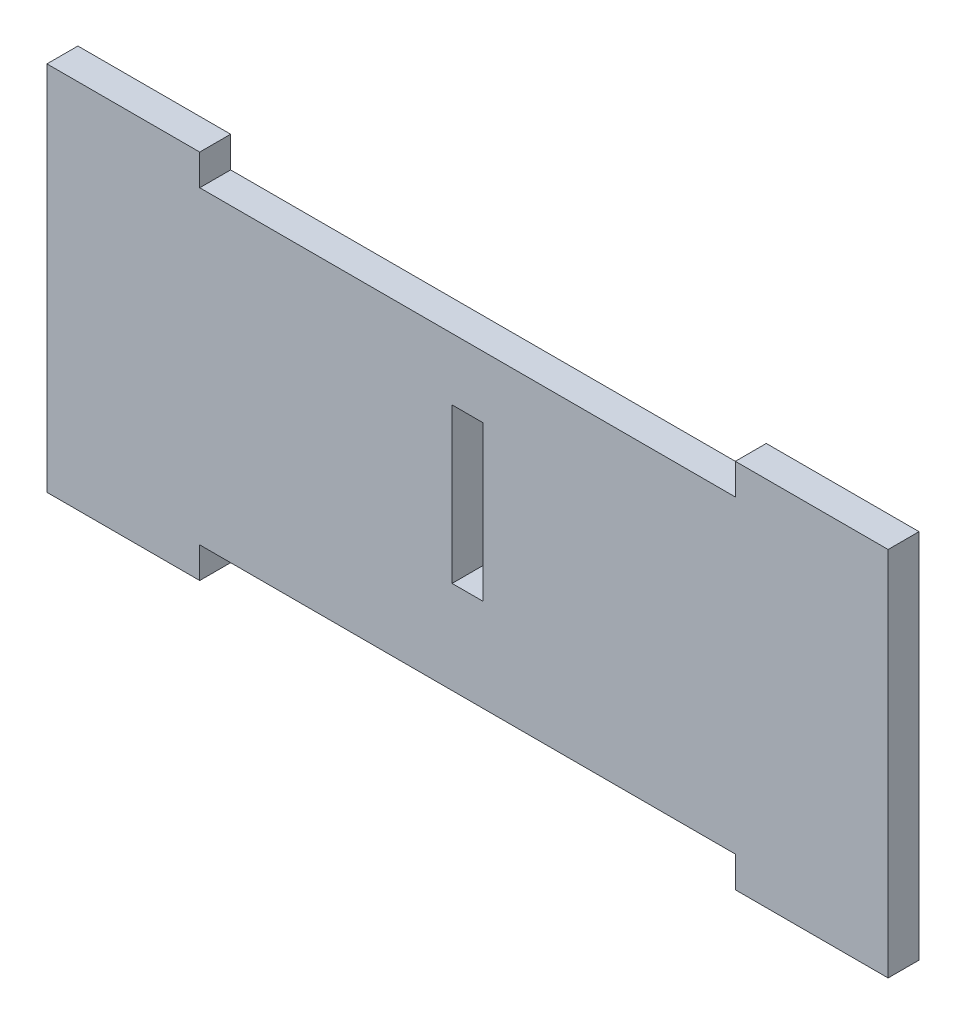
ISO-10303-21;
HEADER;
FILE_DESCRIPTION(('STEP AP214'),'2;1');
FILE_NAME('part.step','',(''),(''),'','','');
FILE_SCHEMA(('AUTOMOTIVE_DESIGN { 1 0 10303 214 1 1 1 1 }'));
ENDSEC;
DATA;
#1=APPLICATION_CONTEXT('core data for automotive mechanical design processes');
#2=APPLICATION_PROTOCOL_DEFINITION('international standard','automotive_design',2000,#1);
#3=PRODUCT_CONTEXT('',#1,'mechanical');
#4=PRODUCT('Part','Part','',(#3));
#5=PRODUCT_RELATED_PRODUCT_CATEGORY('part','',(#4));
#6=PRODUCT_DEFINITION_FORMATION('','',#4);
#7=PRODUCT_DEFINITION_CONTEXT('part definition',#1,'design');
#8=PRODUCT_DEFINITION('design','',#6,#7);
#9=PRODUCT_DEFINITION_SHAPE('','',#8);
#10=(LENGTH_UNIT() NAMED_UNIT(*) SI_UNIT(.MILLI.,.METRE.));
#11=(NAMED_UNIT(*) PLANE_ANGLE_UNIT() SI_UNIT($,.RADIAN.));
#12=(NAMED_UNIT(*) SI_UNIT($,.STERADIAN.) SOLID_ANGLE_UNIT());
#13=UNCERTAINTY_MEASURE_WITH_UNIT(LENGTH_MEASURE(1.E-05),#10,'distance_accuracy_value','');
#14=(GEOMETRIC_REPRESENTATION_CONTEXT(3) GLOBAL_UNCERTAINTY_ASSIGNED_CONTEXT((#13)) GLOBAL_UNIT_ASSIGNED_CONTEXT((#10,
#11,#12)) REPRESENTATION_CONTEXT('',''));
#15=CARTESIAN_POINT('',(0.,0.,0.));
#16=DIRECTION('',(0.,0.,1.));
#17=DIRECTION('',(1.,0.,0.));
#18=AXIS2_PLACEMENT_3D('',#15,#16,#17);
#19=CARTESIAN_POINT('',(-68.,0.,5.));
#20=DIRECTION('',(0.,1.,0.));
#21=DIRECTION('',(0.,0.,1.));
#22=AXIS2_PLACEMENT_3D('',#19,#20,#21);
#23=PLANE('',#22);
#24=DIRECTION('',(0.,0.,-1.));
#25=VECTOR('',#24,1.);
#26=CARTESIAN_POINT('',(43.3,0.,5.));
#27=LINE('',#26,#25);
#28=CARTESIAN_POINT('',(43.3,0.,5.));
#29=VERTEX_POINT('',#28);
#30=CARTESIAN_POINT('',(43.3,0.,0.));
#31=VERTEX_POINT('',#30);
#32=EDGE_CURVE('E191',#29,#31,#27,.T.);
#33=ORIENTED_EDGE('',*,*,#32,.F.);
#34=DIRECTION('',(1.,0.,0.));
#35=VECTOR('',#34,1.);
#36=CARTESIAN_POINT('',(-68.,0.,5.));
#37=LINE('',#36,#35);
#38=CARTESIAN_POINT('',(-43.3,0.,5.));
#39=VERTEX_POINT('',#38);
#40=EDGE_CURVE('E300',#39,#29,#37,.T.);
#41=ORIENTED_EDGE('',*,*,#40,.F.);
#42=DIRECTION('',(0.,0.,1.));
#43=VECTOR('',#42,1.);
#44=CARTESIAN_POINT('',(-43.3,0.,5.));
#45=LINE('',#44,#43);
#46=CARTESIAN_POINT('',(-43.3,0.,0.));
#47=VERTEX_POINT('',#46);
#48=EDGE_CURVE('E218',#47,#39,#45,.T.);
#49=ORIENTED_EDGE('',*,*,#48,.F.);
#50=DIRECTION('',(1.,0.,0.));
#51=VECTOR('',#50,1.);
#52=CARTESIAN_POINT('',(-68.,0.,0.));
#53=LINE('',#52,#51);
#54=EDGE_CURVE('E308',#47,#31,#53,.T.);
#55=ORIENTED_EDGE('',*,*,#54,.T.);
#56=EDGE_LOOP('',(#33,#41,#49,#55));
#57=FACE_BOUND('',#56,.T.);
#58=ADVANCED_FACE('F38',(#57),#23,.F.);
#59=CARTESIAN_POINT('',(-68.,50.,5.));
#60=DIRECTION('',(0.,-1.,0.));
#61=DIRECTION('',(0.,0.,-1.));
#62=AXIS2_PLACEMENT_3D('',#59,#60,#61);
#63=PLANE('',#62);
#64=DIRECTION('',(0.,0.,1.));
#65=VECTOR('',#64,1.);
#66=CARTESIAN_POINT('',(43.3,50.,0.));
#67=LINE('',#66,#65);
#68=CARTESIAN_POINT('',(43.3,50.,0.));
#69=VERTEX_POINT('',#68);
#70=CARTESIAN_POINT('',(43.3,50.,5.));
#71=VERTEX_POINT('',#70);
#72=EDGE_CURVE('E244',#69,#71,#67,.T.);
#73=ORIENTED_EDGE('',*,*,#72,.F.);
#74=DIRECTION('',(-1.,0.,0.));
#75=VECTOR('',#74,1.);
#76=CARTESIAN_POINT('',(-68.,50.,0.));
#77=LINE('',#76,#75);
#78=CARTESIAN_POINT('',(-43.3,50.,0.));
#79=VERTEX_POINT('',#78);
#80=EDGE_CURVE('E42',#69,#79,#77,.T.);
#81=ORIENTED_EDGE('',*,*,#80,.T.);
#82=DIRECTION('',(0.,0.,-1.));
#83=VECTOR('',#82,1.);
#84=CARTESIAN_POINT('',(-43.3,50.,0.));
#85=LINE('',#84,#83);
#86=CARTESIAN_POINT('',(-43.3,50.,5.));
#87=VERTEX_POINT('',#86);
#88=EDGE_CURVE('E270',#87,#79,#85,.T.);
#89=ORIENTED_EDGE('',*,*,#88,.F.);
#90=DIRECTION('',(-1.,0.,0.));
#91=VECTOR('',#90,1.);
#92=CARTESIAN_POINT('',(-68.,50.,5.));
#93=LINE('',#92,#91);
#94=EDGE_CURVE('E11',#71,#87,#93,.T.);
#95=ORIENTED_EDGE('',*,*,#94,.F.);
#96=EDGE_LOOP('',(#73,#81,#89,#95));
#97=FACE_BOUND('',#96,.T.);
#98=ADVANCED_FACE('F320',(#97),#63,.F.);
#99=CARTESIAN_POINT('',(-68.,50.,5.));
#100=DIRECTION('',(1.,0.,0.));
#101=DIRECTION('',(0.,0.,-1.));
#102=AXIS2_PLACEMENT_3D('',#99,#100,#101);
#103=PLANE('',#102);
#104=DIRECTION('',(0.,-1.,0.));
#105=VECTOR('',#104,1.);
#106=CARTESIAN_POINT('',(-68.,50.,0.));
#107=LINE('',#106,#105);
#108=CARTESIAN_POINT('',(-68.,55.,0.));
#109=VERTEX_POINT('',#108);
#110=CARTESIAN_POINT('',(-68.,-5.,0.));
#111=VERTEX_POINT('',#110);
#112=EDGE_CURVE('E296',#109,#111,#107,.T.);
#113=ORIENTED_EDGE('',*,*,#112,.T.);
#114=DIRECTION('',(0.,0.,-1.));
#115=VECTOR('',#114,1.);
#116=CARTESIAN_POINT('',(-68.,-5.,5.));
#117=LINE('',#116,#115);
#118=CARTESIAN_POINT('',(-68.,-5.,5.));
#119=VERTEX_POINT('',#118);
#120=EDGE_CURVE('E219',#119,#111,#117,.T.);
#121=ORIENTED_EDGE('',*,*,#120,.F.);
#122=DIRECTION('',(0.,-1.,0.));
#123=VECTOR('',#122,1.);
#124=CARTESIAN_POINT('',(-68.,50.,5.));
#125=LINE('',#124,#123);
#126=CARTESIAN_POINT('',(-68.,55.,5.));
#127=VERTEX_POINT('',#126);
#128=EDGE_CURVE('E297',#127,#119,#125,.T.);
#129=ORIENTED_EDGE('',*,*,#128,.F.);
#130=DIRECTION('',(0.,0.,1.));
#131=VECTOR('',#130,1.);
#132=CARTESIAN_POINT('',(-68.,55.,0.));
#133=LINE('',#132,#131);
#134=EDGE_CURVE('E271',#109,#127,#133,.T.);
#135=ORIENTED_EDGE('',*,*,#134,.F.);
#136=EDGE_LOOP('',(#113,#121,#129,#135));
#137=FACE_BOUND('',#136,.T.);
#138=ADVANCED_FACE('F40',(#137),#103,.F.);
#139=CARTESIAN_POINT('',(68.,50.,5.));
#140=DIRECTION('',(-1.,0.,0.));
#141=DIRECTION('',(0.,0.,1.));
#142=AXIS2_PLACEMENT_3D('',#139,#140,#141);
#143=PLANE('',#142);
#144=DIRECTION('',(0.,1.,0.));
#145=VECTOR('',#144,1.);
#146=CARTESIAN_POINT('',(68.,50.,0.));
#147=LINE('',#146,#145);
#148=CARTESIAN_POINT('',(68.,-5.,0.));
#149=VERTEX_POINT('',#148);
#150=CARTESIAN_POINT('',(68.,55.,0.));
#151=VERTEX_POINT('',#150);
#152=EDGE_CURVE('E310',#149,#151,#147,.T.);
#153=ORIENTED_EDGE('',*,*,#152,.T.);
#154=DIRECTION('',(0.,0.,-1.));
#155=VECTOR('',#154,1.);
#156=CARTESIAN_POINT('',(68.,55.,0.));
#157=LINE('',#156,#155);
#158=CARTESIAN_POINT('',(68.,55.,5.));
#159=VERTEX_POINT('',#158);
#160=EDGE_CURVE('E245',#159,#151,#157,.T.);
#161=ORIENTED_EDGE('',*,*,#160,.F.);
#162=DIRECTION('',(0.,1.,0.));
#163=VECTOR('',#162,1.);
#164=CARTESIAN_POINT('',(68.,50.,5.));
#165=LINE('',#164,#163);
#166=CARTESIAN_POINT('',(68.,-5.,5.));
#167=VERTEX_POINT('',#166);
#168=EDGE_CURVE('E48',#167,#159,#165,.T.);
#169=ORIENTED_EDGE('',*,*,#168,.F.);
#170=DIRECTION('',(0.,0.,1.));
#171=VECTOR('',#170,1.);
#172=CARTESIAN_POINT('',(68.,-5.,5.));
#173=LINE('',#172,#171);
#174=EDGE_CURVE('E193',#149,#167,#173,.T.);
#175=ORIENTED_EDGE('',*,*,#174,.F.);
#176=EDGE_LOOP('',(#153,#161,#169,#175));
#177=FACE_BOUND('',#176,.T.);
#178=ADVANCED_FACE('F346',(#177),#143,.F.);
#179=CARTESIAN_POINT('',(0.,0.,5.));
#180=DIRECTION('',(0.,0.,1.));
#181=DIRECTION('',(1.,0.,0.));
#182=AXIS2_PLACEMENT_3D('',#179,#180,#181);
#183=PLANE('',#182);
#184=DIRECTION('',(1.,0.,0.));
#185=VECTOR('',#184,1.);
#186=CARTESIAN_POINT('',(2.5,15.,5.));
#187=LINE('',#186,#185);
#188=CARTESIAN_POINT('',(-2.5,15.,5.));
#189=VERTEX_POINT('',#188);
#190=CARTESIAN_POINT('',(2.5,15.,5.));
#191=VERTEX_POINT('',#190);
#192=EDGE_CURVE('E56',#189,#191,#187,.T.);
#193=ORIENTED_EDGE('',*,*,#192,.F.);
#194=DIRECTION('',(0.,-1.,0.));
#195=VECTOR('',#194,1.);
#196=CARTESIAN_POINT('',(-2.5,15.,5.));
#197=LINE('',#196,#195);
#198=CARTESIAN_POINT('',(-2.5,40.,5.));
#199=VERTEX_POINT('',#198);
#200=EDGE_CURVE('E174',#199,#189,#197,.T.);
#201=ORIENTED_EDGE('',*,*,#200,.F.);
#202=DIRECTION('',(-1.,0.,0.));
#203=VECTOR('',#202,1.);
#204=CARTESIAN_POINT('',(-2.5,40.,5.));
#205=LINE('',#204,#203);
#206=CARTESIAN_POINT('',(2.5,40.,5.));
#207=VERTEX_POINT('',#206);
#208=EDGE_CURVE('E156',#207,#199,#205,.T.);
#209=ORIENTED_EDGE('',*,*,#208,.F.);
#210=DIRECTION('',(0.,1.,0.));
#211=VECTOR('',#210,1.);
#212=CARTESIAN_POINT('',(2.5,40.,5.));
#213=LINE('',#212,#211);
#214=EDGE_CURVE('E166',#191,#207,#213,.T.);
#215=ORIENTED_EDGE('',*,*,#214,.F.);
#216=EDGE_LOOP('',(#193,#201,#209,#215));
#217=FACE_BOUND('',#216,.T.);
#218=ORIENTED_EDGE('',*,*,#128,.T.);
#219=DIRECTION('',(-1.,0.,0.));
#220=VECTOR('',#219,1.);
#221=CARTESIAN_POINT('',(-68.,-5.,5.));
#222=LINE('',#221,#220);
#223=CARTESIAN_POINT('',(-43.3,-5.,5.));
#224=VERTEX_POINT('',#223);
#225=EDGE_CURVE('E229',#224,#119,#222,.T.);
#226=ORIENTED_EDGE('',*,*,#225,.F.);
#227=DIRECTION('',(0.,1.,0.));
#228=VECTOR('',#227,1.);
#229=CARTESIAN_POINT('',(-43.3,-5.,5.));
#230=LINE('',#229,#228);
#231=EDGE_CURVE('E233',#224,#39,#230,.T.);
#232=ORIENTED_EDGE('',*,*,#231,.T.);
#233=ORIENTED_EDGE('',*,*,#40,.T.);
#234=DIRECTION('',(0.,1.,0.));
#235=VECTOR('',#234,1.);
#236=CARTESIAN_POINT('',(43.3,-5.,5.));
#237=LINE('',#236,#235);
#238=CARTESIAN_POINT('',(43.3,-5.,5.));
#239=VERTEX_POINT('',#238);
#240=EDGE_CURVE('E214',#239,#29,#237,.T.);
#241=ORIENTED_EDGE('',*,*,#240,.F.);
#242=DIRECTION('',(-1.,0.,0.));
#243=VECTOR('',#242,1.);
#244=CARTESIAN_POINT('',(68.,-5.,5.));
#245=LINE('',#244,#243);
#246=EDGE_CURVE('E197',#167,#239,#245,.T.);
#247=ORIENTED_EDGE('',*,*,#246,.F.);
#248=ORIENTED_EDGE('',*,*,#168,.T.);
#249=DIRECTION('',(1.,0.,0.));
#250=VECTOR('',#249,1.);
#251=CARTESIAN_POINT('',(68.,55.,5.));
#252=LINE('',#251,#250);
#253=CARTESIAN_POINT('',(43.3,55.,5.));
#254=VERTEX_POINT('',#253);
#255=EDGE_CURVE('E255',#254,#159,#252,.T.);
#256=ORIENTED_EDGE('',*,*,#255,.F.);
#257=DIRECTION('',(0.,-1.,0.));
#258=VECTOR('',#257,1.);
#259=CARTESIAN_POINT('',(43.3,55.,5.));
#260=LINE('',#259,#258);
#261=EDGE_CURVE('E259',#254,#71,#260,.T.);
#262=ORIENTED_EDGE('',*,*,#261,.T.);
#263=ORIENTED_EDGE('',*,*,#94,.T.);
#264=DIRECTION('',(0.,-1.,0.));
#265=VECTOR('',#264,1.);
#266=CARTESIAN_POINT('',(-43.3,55.,5.));
#267=LINE('',#266,#265);
#268=CARTESIAN_POINT('',(-43.3,55.,5.));
#269=VERTEX_POINT('',#268);
#270=EDGE_CURVE('E292',#269,#87,#267,.T.);
#271=ORIENTED_EDGE('',*,*,#270,.F.);
#272=DIRECTION('',(1.,0.,0.));
#273=VECTOR('',#272,1.);
#274=CARTESIAN_POINT('',(-68.,55.,5.));
#275=LINE('',#274,#273);
#276=EDGE_CURVE('E275',#127,#269,#275,.T.);
#277=ORIENTED_EDGE('',*,*,#276,.F.);
#278=EDGE_LOOP('',(#218,#226,#232,#233,#241,#247,#248,#256,#262,#263,#271,#277));
#279=FACE_BOUND('',#278,.T.);
#280=ADVANCED_FACE('F171',(#217,#279),#183,.T.);
#281=CARTESIAN_POINT('',(0.,0.,0.));
#282=DIRECTION('',(0.,0.,1.));
#283=DIRECTION('',(1.,0.,0.));
#284=AXIS2_PLACEMENT_3D('',#281,#282,#283);
#285=PLANE('',#284);
#286=DIRECTION('',(0.,1.,0.));
#287=VECTOR('',#286,1.);
#288=CARTESIAN_POINT('',(-2.5,15.,0.));
#289=LINE('',#288,#287);
#290=CARTESIAN_POINT('',(-2.5,15.,0.));
#291=VERTEX_POINT('',#290);
#292=CARTESIAN_POINT('',(-2.5,40.,0.));
#293=VERTEX_POINT('',#292);
#294=EDGE_CURVE('E471',#291,#293,#289,.T.);
#295=ORIENTED_EDGE('',*,*,#294,.F.);
#296=DIRECTION('',(-1.,0.,0.));
#297=VECTOR('',#296,1.);
#298=CARTESIAN_POINT('',(2.5,15.,0.));
#299=LINE('',#298,#297);
#300=CARTESIAN_POINT('',(2.5,15.,0.));
#301=VERTEX_POINT('',#300);
#302=EDGE_CURVE('E192',#301,#291,#299,.T.);
#303=ORIENTED_EDGE('',*,*,#302,.F.);
#304=DIRECTION('',(0.,-1.,0.));
#305=VECTOR('',#304,1.);
#306=CARTESIAN_POINT('',(2.5,40.,0.));
#307=LINE('',#306,#305);
#308=CARTESIAN_POINT('',(2.5,40.,0.));
#309=VERTEX_POINT('',#308);
#310=EDGE_CURVE('E188',#309,#301,#307,.T.);
#311=ORIENTED_EDGE('',*,*,#310,.F.);
#312=DIRECTION('',(1.,0.,0.));
#313=VECTOR('',#312,1.);
#314=CARTESIAN_POINT('',(-2.5,40.,0.));
#315=LINE('',#314,#313);
#316=EDGE_CURVE('E159',#293,#309,#315,.T.);
#317=ORIENTED_EDGE('',*,*,#316,.F.);
#318=EDGE_LOOP('',(#295,#303,#311,#317));
#319=FACE_BOUND('',#318,.T.);
#320=ORIENTED_EDGE('',*,*,#112,.F.);
#321=DIRECTION('',(-1.,0.,0.));
#322=VECTOR('',#321,1.);
#323=CARTESIAN_POINT('',(-68.,55.,0.));
#324=LINE('',#323,#322);
#325=CARTESIAN_POINT('',(-43.3,55.,0.));
#326=VERTEX_POINT('',#325);
#327=EDGE_CURVE('E281',#326,#109,#324,.T.);
#328=ORIENTED_EDGE('',*,*,#327,.F.);
#329=DIRECTION('',(0.,-1.,0.));
#330=VECTOR('',#329,1.);
#331=CARTESIAN_POINT('',(-43.3,55.,0.));
#332=LINE('',#331,#330);
#333=EDGE_CURVE('E285',#326,#79,#332,.T.);
#334=ORIENTED_EDGE('',*,*,#333,.T.);
#335=ORIENTED_EDGE('',*,*,#80,.F.);
#336=DIRECTION('',(0.,-1.,0.));
#337=VECTOR('',#336,1.);
#338=CARTESIAN_POINT('',(43.3,55.,0.));
#339=LINE('',#338,#337);
#340=CARTESIAN_POINT('',(43.3,55.,0.));
#341=VERTEX_POINT('',#340);
#342=EDGE_CURVE('E266',#341,#69,#339,.T.);
#343=ORIENTED_EDGE('',*,*,#342,.F.);
#344=DIRECTION('',(-1.,0.,0.));
#345=VECTOR('',#344,1.);
#346=CARTESIAN_POINT('',(68.,55.,0.));
#347=LINE('',#346,#345);
#348=EDGE_CURVE('E249',#151,#341,#347,.T.);
#349=ORIENTED_EDGE('',*,*,#348,.F.);
#350=ORIENTED_EDGE('',*,*,#152,.F.);
#351=DIRECTION('',(1.,0.,0.));
#352=VECTOR('',#351,1.);
#353=CARTESIAN_POINT('',(68.,-5.,0.));
#354=LINE('',#353,#352);
#355=CARTESIAN_POINT('',(43.3,-5.,0.));
#356=VERTEX_POINT('',#355);
#357=EDGE_CURVE('E203',#356,#149,#354,.T.);
#358=ORIENTED_EDGE('',*,*,#357,.F.);
#359=DIRECTION('',(0.,1.,0.));
#360=VECTOR('',#359,1.);
#361=CARTESIAN_POINT('',(43.3,-5.,0.));
#362=LINE('',#361,#360);
#363=EDGE_CURVE('E207',#356,#31,#362,.T.);
#364=ORIENTED_EDGE('',*,*,#363,.T.);
#365=ORIENTED_EDGE('',*,*,#54,.F.);
#366=DIRECTION('',(0.,1.,0.));
#367=VECTOR('',#366,1.);
#368=CARTESIAN_POINT('',(-43.3,-5.,0.));
#369=LINE('',#368,#367);
#370=CARTESIAN_POINT('',(-43.3,-5.,0.));
#371=VERTEX_POINT('',#370);
#372=EDGE_CURVE('E240',#371,#47,#369,.T.);
#373=ORIENTED_EDGE('',*,*,#372,.F.);
#374=DIRECTION('',(1.,0.,0.));
#375=VECTOR('',#374,1.);
#376=CARTESIAN_POINT('',(-68.,-5.,0.));
#377=LINE('',#376,#375);
#378=EDGE_CURVE('E223',#111,#371,#377,.T.);
#379=ORIENTED_EDGE('',*,*,#378,.F.);
#380=EDGE_LOOP('',(#320,#328,#334,#335,#343,#349,#350,#358,#364,#365,#373,#379));
#381=FACE_BOUND('',#380,.T.);
#382=ADVANCED_FACE('F329',(#319,#381),#285,.F.);
#383=CARTESIAN_POINT('',(-43.3,55.,0.));
#384=DIRECTION('',(-1.,0.,0.));
#385=DIRECTION('',(0.,0.,1.));
#386=AXIS2_PLACEMENT_3D('',#383,#384,#385);
#387=PLANE('',#386);
#388=ORIENTED_EDGE('',*,*,#88,.T.);
#389=ORIENTED_EDGE('',*,*,#333,.F.);
#390=DIRECTION('',(0.,0.,-1.));
#391=VECTOR('',#390,1.);
#392=CARTESIAN_POINT('',(-43.3,55.,0.));
#393=LINE('',#392,#391);
#394=EDGE_CURVE('E278',#269,#326,#393,.T.);
#395=ORIENTED_EDGE('',*,*,#394,.F.);
#396=ORIENTED_EDGE('',*,*,#270,.T.);
#397=EDGE_LOOP('',(#388,#389,#395,#396));
#398=FACE_BOUND('',#397,.T.);
#399=ADVANCED_FACE('F325',(#398),#387,.F.);
#400=CARTESIAN_POINT('',(0.,55.,0.));
#401=DIRECTION('',(0.,1.,0.));
#402=DIRECTION('',(0.,0.,1.));
#403=AXIS2_PLACEMENT_3D('',#400,#401,#402);
#404=PLANE('',#403);
#405=ORIENTED_EDGE('',*,*,#134,.T.);
#406=ORIENTED_EDGE('',*,*,#276,.T.);
#407=ORIENTED_EDGE('',*,*,#394,.T.);
#408=ORIENTED_EDGE('',*,*,#327,.T.);
#409=EDGE_LOOP('',(#405,#406,#407,#408));
#410=FACE_BOUND('',#409,.T.);
#411=ADVANCED_FACE('F333',(#410),#404,.T.);
#412=CARTESIAN_POINT('',(43.3,55.,0.));
#413=DIRECTION('',(1.,0.,0.));
#414=DIRECTION('',(0.,0.,-1.));
#415=AXIS2_PLACEMENT_3D('',#412,#413,#414);
#416=PLANE('',#415);
#417=ORIENTED_EDGE('',*,*,#72,.T.);
#418=ORIENTED_EDGE('',*,*,#261,.F.);
#419=DIRECTION('',(0.,0.,1.));
#420=VECTOR('',#419,1.);
#421=CARTESIAN_POINT('',(43.3,55.,0.));
#422=LINE('',#421,#420);
#423=EDGE_CURVE('E252',#341,#254,#422,.T.);
#424=ORIENTED_EDGE('',*,*,#423,.F.);
#425=ORIENTED_EDGE('',*,*,#342,.T.);
#426=EDGE_LOOP('',(#417,#418,#424,#425));
#427=FACE_BOUND('',#426,.T.);
#428=ADVANCED_FACE('F341',(#427),#416,.F.);
#429=CARTESIAN_POINT('',(0.,55.,0.));
#430=DIRECTION('',(0.,-1.,0.));
#431=DIRECTION('',(0.,0.,-1.));
#432=AXIS2_PLACEMENT_3D('',#429,#430,#431);
#433=PLANE('',#432);
#434=ORIENTED_EDGE('',*,*,#160,.T.);
#435=ORIENTED_EDGE('',*,*,#348,.T.);
#436=ORIENTED_EDGE('',*,*,#423,.T.);
#437=ORIENTED_EDGE('',*,*,#255,.T.);
#438=EDGE_LOOP('',(#434,#435,#436,#437));
#439=FACE_BOUND('',#438,.T.);
#440=ADVANCED_FACE('F345',(#439),#433,.F.);
#441=CARTESIAN_POINT('',(-43.3,-5.,5.));
#442=DIRECTION('',(-1.,0.,0.));
#443=DIRECTION('',(0.,0.,1.));
#444=AXIS2_PLACEMENT_3D('',#441,#442,#443);
#445=PLANE('',#444);
#446=ORIENTED_EDGE('',*,*,#48,.T.);
#447=ORIENTED_EDGE('',*,*,#231,.F.);
#448=DIRECTION('',(0.,0.,1.));
#449=VECTOR('',#448,1.);
#450=CARTESIAN_POINT('',(-43.3,-5.,5.));
#451=LINE('',#450,#449);
#452=EDGE_CURVE('E226',#371,#224,#451,.T.);
#453=ORIENTED_EDGE('',*,*,#452,.F.);
#454=ORIENTED_EDGE('',*,*,#372,.T.);
#455=EDGE_LOOP('',(#446,#447,#453,#454));
#456=FACE_BOUND('',#455,.T.);
#457=ADVANCED_FACE('F361',(#456),#445,.F.);
#458=CARTESIAN_POINT('',(0.,-5.,0.));
#459=DIRECTION('',(0.,-1.,0.));
#460=DIRECTION('',(0.,0.,-1.));
#461=AXIS2_PLACEMENT_3D('',#458,#459,#460);
#462=PLANE('',#461);
#463=ORIENTED_EDGE('',*,*,#120,.T.);
#464=ORIENTED_EDGE('',*,*,#378,.T.);
#465=ORIENTED_EDGE('',*,*,#452,.T.);
#466=ORIENTED_EDGE('',*,*,#225,.T.);
#467=EDGE_LOOP('',(#463,#464,#465,#466));
#468=FACE_BOUND('',#467,.T.);
#469=ADVANCED_FACE('F363',(#468),#462,.T.);
#470=CARTESIAN_POINT('',(43.3,-5.,5.));
#471=DIRECTION('',(1.,0.,0.));
#472=DIRECTION('',(0.,0.,-1.));
#473=AXIS2_PLACEMENT_3D('',#470,#471,#472);
#474=PLANE('',#473);
#475=ORIENTED_EDGE('',*,*,#32,.T.);
#476=ORIENTED_EDGE('',*,*,#363,.F.);
#477=DIRECTION('',(0.,0.,-1.));
#478=VECTOR('',#477,1.);
#479=CARTESIAN_POINT('',(43.3,-5.,5.));
#480=LINE('',#479,#478);
#481=EDGE_CURVE('E200',#239,#356,#480,.T.);
#482=ORIENTED_EDGE('',*,*,#481,.F.);
#483=ORIENTED_EDGE('',*,*,#240,.T.);
#484=EDGE_LOOP('',(#475,#476,#482,#483));
#485=FACE_BOUND('',#484,.T.);
#486=ADVANCED_FACE('F356',(#485),#474,.F.);
#487=CARTESIAN_POINT('',(0.,-5.,0.));
#488=DIRECTION('',(0.,1.,0.));
#489=DIRECTION('',(0.,0.,1.));
#490=AXIS2_PLACEMENT_3D('',#487,#488,#489);
#491=PLANE('',#490);
#492=ORIENTED_EDGE('',*,*,#174,.T.);
#493=ORIENTED_EDGE('',*,*,#246,.T.);
#494=ORIENTED_EDGE('',*,*,#481,.T.);
#495=ORIENTED_EDGE('',*,*,#357,.T.);
#496=EDGE_LOOP('',(#492,#493,#494,#495));
#497=FACE_BOUND('',#496,.T.);
#498=ADVANCED_FACE('F351',(#497),#491,.F.);
#499=CARTESIAN_POINT('',(2.5,15.,-25.4950975679639));
#500=DIRECTION('',(0.,-1.,0.));
#501=DIRECTION('',(0.,0.,-1.));
#502=AXIS2_PLACEMENT_3D('',#499,#500,#501);
#503=PLANE('',#502);
#504=ORIENTED_EDGE('',*,*,#302,.T.);
#505=DIRECTION('',(0.,0.,1.));
#506=VECTOR('',#505,1.);
#507=CARTESIAN_POINT('',(-2.5,15.,-25.4950975679639));
#508=LINE('',#507,#506);
#509=EDGE_CURVE('E181',#291,#189,#508,.T.);
#510=ORIENTED_EDGE('',*,*,#509,.T.);
#511=ORIENTED_EDGE('',*,*,#192,.T.);
#512=DIRECTION('',(0.,0.,1.));
#513=VECTOR('',#512,1.);
#514=CARTESIAN_POINT('',(2.5,15.,-25.4950975679639));
#515=LINE('',#514,#513);
#516=EDGE_CURVE('E163',#301,#191,#515,.T.);
#517=ORIENTED_EDGE('',*,*,#516,.F.);
#518=EDGE_LOOP('',(#504,#510,#511,#517));
#519=FACE_BOUND('',#518,.T.);
#520=ADVANCED_FACE('F423',(#519),#503,.F.);
#521=CARTESIAN_POINT('',(-2.5,15.,-25.4950975679639));
#522=DIRECTION('',(-1.,0.,0.));
#523=DIRECTION('',(0.,0.,1.));
#524=AXIS2_PLACEMENT_3D('',#521,#522,#523);
#525=PLANE('',#524);
#526=ORIENTED_EDGE('',*,*,#294,.T.);
#527=DIRECTION('',(0.,0.,1.));
#528=VECTOR('',#527,1.);
#529=CARTESIAN_POINT('',(-2.5,40.,-25.4950975679639));
#530=LINE('',#529,#528);
#531=EDGE_CURVE('E162',#293,#199,#530,.T.);
#532=ORIENTED_EDGE('',*,*,#531,.T.);
#533=ORIENTED_EDGE('',*,*,#200,.T.);
#534=ORIENTED_EDGE('',*,*,#509,.F.);
#535=EDGE_LOOP('',(#526,#532,#533,#534));
#536=FACE_BOUND('',#535,.T.);
#537=ADVANCED_FACE('F440',(#536),#525,.F.);
#538=CARTESIAN_POINT('',(-2.5,40.,-25.4950975679639));
#539=DIRECTION('',(0.,1.,0.));
#540=DIRECTION('',(0.,0.,1.));
#541=AXIS2_PLACEMENT_3D('',#538,#539,#540);
#542=PLANE('',#541);
#543=ORIENTED_EDGE('',*,*,#316,.T.);
#544=DIRECTION('',(0.,0.,1.));
#545=VECTOR('',#544,1.);
#546=CARTESIAN_POINT('',(2.5,40.,-25.4950975679639));
#547=LINE('',#546,#545);
#548=EDGE_CURVE('E64',#309,#207,#547,.T.);
#549=ORIENTED_EDGE('',*,*,#548,.T.);
#550=ORIENTED_EDGE('',*,*,#208,.T.);
#551=ORIENTED_EDGE('',*,*,#531,.F.);
#552=EDGE_LOOP('',(#543,#549,#550,#551));
#553=FACE_BOUND('',#552,.T.);
#554=ADVANCED_FACE('F153',(#553),#542,.F.);
#555=CARTESIAN_POINT('',(2.5,40.,-25.4950975679639));
#556=DIRECTION('',(1.,0.,0.));
#557=DIRECTION('',(0.,1.,0.));
#558=AXIS2_PLACEMENT_3D('',#555,#556,#557);
#559=PLANE('',#558);
#560=ORIENTED_EDGE('',*,*,#310,.T.);
#561=ORIENTED_EDGE('',*,*,#516,.T.);
#562=ORIENTED_EDGE('',*,*,#214,.T.);
#563=ORIENTED_EDGE('',*,*,#548,.F.);
#564=EDGE_LOOP('',(#560,#561,#562,#563));
#565=FACE_BOUND('',#564,.T.);
#566=ADVANCED_FACE('F167',(#565),#559,.F.);
#567=CLOSED_SHELL('',(#58,#98,#138,#178,#280,#382,#399,#411,#428,#440,#457,#469,#486,#498,#520,
#537,#554,#566));
#568=MANIFOLD_SOLID_BREP('B2',#567);
#569=ADVANCED_BREP_SHAPE_REPRESENTATION('',(#18,#568),#14);
#570=SHAPE_DEFINITION_REPRESENTATION(#9,#569);
ENDSEC;
END-ISO-10303-21;
